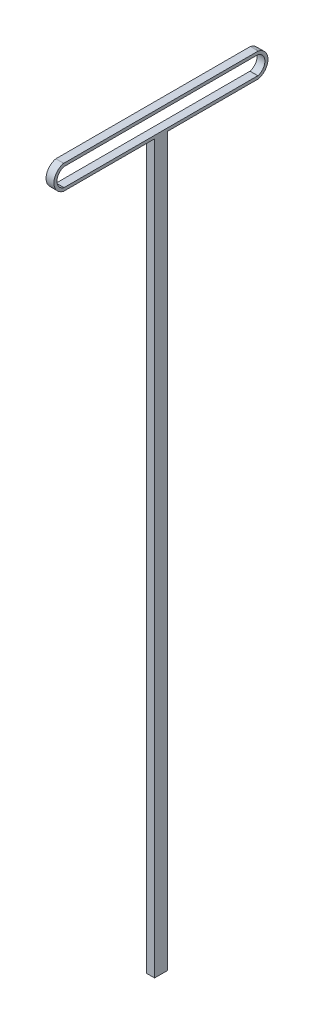
ISO-10303-21;
HEADER;
FILE_DESCRIPTION(('STEP AP214'),'2;1');
FILE_NAME('part.step','',(''),(''),'','','');
FILE_SCHEMA(('AUTOMOTIVE_DESIGN { 1 0 10303 214 1 1 1 1 }'));
ENDSEC;
DATA;
#1=APPLICATION_CONTEXT('core data for automotive mechanical design processes');
#2=APPLICATION_PROTOCOL_DEFINITION('international standard','automotive_design',2000,#1);
#3=PRODUCT_CONTEXT('',#1,'mechanical');
#4=PRODUCT('Part','Part','',(#3));
#5=PRODUCT_RELATED_PRODUCT_CATEGORY('part','',(#4));
#6=PRODUCT_DEFINITION_FORMATION('','',#4);
#7=PRODUCT_DEFINITION_CONTEXT('part definition',#1,'design');
#8=PRODUCT_DEFINITION('design','',#6,#7);
#9=PRODUCT_DEFINITION_SHAPE('','',#8);
#10=(LENGTH_UNIT() NAMED_UNIT(*) SI_UNIT(.MILLI.,.METRE.));
#11=(NAMED_UNIT(*) PLANE_ANGLE_UNIT() SI_UNIT($,.RADIAN.));
#12=(NAMED_UNIT(*) SI_UNIT($,.STERADIAN.) SOLID_ANGLE_UNIT());
#13=UNCERTAINTY_MEASURE_WITH_UNIT(LENGTH_MEASURE(1.E-05),#10,'distance_accuracy_value','');
#14=(GEOMETRIC_REPRESENTATION_CONTEXT(3) GLOBAL_UNCERTAINTY_ASSIGNED_CONTEXT((#13)) GLOBAL_UNIT_ASSIGNED_CONTEXT((#10,
#11,#12)) REPRESENTATION_CONTEXT('',''));
#15=CARTESIAN_POINT('',(0.,0.,0.));
#16=DIRECTION('',(0.,0.,1.));
#17=DIRECTION('',(1.,0.,0.));
#18=AXIS2_PLACEMENT_3D('',#15,#16,#17);
#19=CARTESIAN_POINT('',(6.5,-20.,160.579938888516));
#20=DIRECTION('',(0.,1.,0.));
#21=DIRECTION('',(0.,0.,1.));
#22=AXIS2_PLACEMENT_3D('',#19,#20,#21);
#23=PLANE('',#22);
#24=DIRECTION('',(1.,0.,0.));
#25=VECTOR('',#24,1.);
#26=CARTESIAN_POINT('',(-6.5,-20.,-10.4938581085758));
#27=LINE('',#26,#25);
#28=CARTESIAN_POINT('',(-6.5,-20.,-10.4938581085757));
#29=VERTEX_POINT('',#28);
#30=CARTESIAN_POINT('',(6.5,-20.,-10.4938581085757));
#31=VERTEX_POINT('',#30);
#32=EDGE_CURVE('E142',#29,#31,#27,.T.);
#33=ORIENTED_EDGE('',*,*,#32,.F.);
#34=DIRECTION('',(0.,0.,-1.));
#35=VECTOR('',#34,1.);
#36=CARTESIAN_POINT('',(-6.5,-20.,160.579938888516));
#37=LINE('',#36,#35);
#38=CARTESIAN_POINT('',(-6.5,-20.,-160.579938888516));
#39=VERTEX_POINT('',#38);
#40=EDGE_CURVE('E196',#29,#39,#37,.T.);
#41=ORIENTED_EDGE('',*,*,#40,.T.);
#42=DIRECTION('',(-1.,0.,0.));
#43=VECTOR('',#42,1.);
#44=CARTESIAN_POINT('',(6.5,-20.,-160.579938888516));
#45=LINE('',#44,#43);
#46=CARTESIAN_POINT('',(6.5,-20.,-160.579938888516));
#47=VERTEX_POINT('',#46);
#48=EDGE_CURVE('E42',#47,#39,#45,.T.);
#49=ORIENTED_EDGE('',*,*,#48,.F.);
#50=DIRECTION('',(0.,0.,-1.));
#51=VECTOR('',#50,1.);
#52=CARTESIAN_POINT('',(6.5,-20.,160.579938888516));
#53=LINE('',#52,#51);
#54=EDGE_CURVE('E49',#31,#47,#53,.T.);
#55=ORIENTED_EDGE('',*,*,#54,.F.);
#56=EDGE_LOOP('',(#33,#41,#49,#55));
#57=FACE_BOUND('',#56,.T.);
#58=ADVANCED_FACE('F34',(#57),#23,.F.);
#59=DIRECTION('',(-1.,0.,0.));
#60=VECTOR('',#59,1.);
#61=CARTESIAN_POINT('',(-6.5,-20.,10.4938581085758));
#62=LINE('',#61,#60);
#63=CARTESIAN_POINT('',(6.5,-20.,10.4938581085758));
#64=VERTEX_POINT('',#63);
#65=CARTESIAN_POINT('',(-6.5,-20.,10.4938581085758));
#66=VERTEX_POINT('',#65);
#67=EDGE_CURVE('E57',#64,#66,#62,.T.);
#68=ORIENTED_EDGE('',*,*,#67,.F.);
#69=CARTESIAN_POINT('',(6.5,-20.,160.579938888516));
#70=VERTEX_POINT('',#69);
#71=EDGE_CURVE('E147',#70,#64,#53,.T.);
#72=ORIENTED_EDGE('',*,*,#71,.F.);
#73=DIRECTION('',(-1.,0.,0.));
#74=VECTOR('',#73,1.);
#75=CARTESIAN_POINT('',(6.5,-20.,160.579938888516));
#76=LINE('',#75,#74);
#77=CARTESIAN_POINT('',(-6.5,-20.,160.579938888516));
#78=VERTEX_POINT('',#77);
#79=EDGE_CURVE('E11',#70,#78,#76,.T.);
#80=ORIENTED_EDGE('',*,*,#79,.T.);
#81=EDGE_CURVE('E197',#78,#66,#37,.T.);
#82=ORIENTED_EDGE('',*,*,#81,.T.);
#83=EDGE_LOOP('',(#68,#72,#80,#82));
#84=FACE_BOUND('',#83,.T.);
#85=ADVANCED_FACE('F245',(#84),#23,.F.);
#86=CARTESIAN_POINT('',(6.5,0.,156.195855798208));
#87=DIRECTION('',(1.,0.,0.));
#88=DIRECTION('',(0.,0.,-1.));
#89=AXIS2_PLACEMENT_3D('',#86,#87,#88);
#90=PLANE('',#89);
#91=CARTESIAN_POINT('',(6.5,0.,156.195855798208));
#92=DIRECTION('',(1.,0.,0.));
#93=DIRECTION('',(0.,0.,-1.));
#94=AXIS2_PLACEMENT_3D('',#91,#92,#93);
#95=CIRCLE('',#94,20.4748671434693);
#96=CARTESIAN_POINT('',(6.5,20.,160.579938888516));
#97=VERTEX_POINT('',#96);
#98=EDGE_CURVE('E185',#97,#70,#95,.T.);
#99=ORIENTED_EDGE('',*,*,#98,.T.);
#100=ORIENTED_EDGE('',*,*,#71,.T.);
#101=DIRECTION('',(0.,1.,0.));
#102=VECTOR('',#101,1.);
#103=CARTESIAN_POINT('',(6.5,-1220.,10.4938581085758));
#104=LINE('',#103,#102);
#105=CARTESIAN_POINT('',(6.5,-1220.,10.4938581085758));
#106=VERTEX_POINT('',#105);
#107=EDGE_CURVE('E127',#106,#64,#104,.T.);
#108=ORIENTED_EDGE('',*,*,#107,.F.);
#109=DIRECTION('',(0.,0.,1.));
#110=VECTOR('',#109,1.);
#111=CARTESIAN_POINT('',(6.5,-1220.,10.4938581085758));
#112=LINE('',#111,#110);
#113=CARTESIAN_POINT('',(6.5,-1220.,-10.4938581085758));
#114=VERTEX_POINT('',#113);
#115=EDGE_CURVE('E133',#114,#106,#112,.T.);
#116=ORIENTED_EDGE('',*,*,#115,.F.);
#117=DIRECTION('',(0.,1.,0.));
#118=VECTOR('',#117,1.);
#119=CARTESIAN_POINT('',(6.5,-1220.,-10.4938581085758));
#120=LINE('',#119,#118);
#121=EDGE_CURVE('E227',#114,#31,#120,.T.);
#122=ORIENTED_EDGE('',*,*,#121,.T.);
#123=ORIENTED_EDGE('',*,*,#54,.T.);
#124=CARTESIAN_POINT('',(6.5,0.,-156.195855798208));
#125=DIRECTION('',(1.,0.,0.));
#126=DIRECTION('',(0.,0.,1.));
#127=AXIS2_PLACEMENT_3D('',#124,#125,#126);
#128=CIRCLE('',#127,20.4748671434693);
#129=CARTESIAN_POINT('',(6.5,20.,-160.579938888516));
#130=VERTEX_POINT('',#129);
#131=EDGE_CURVE('E189',#47,#130,#128,.T.);
#132=ORIENTED_EDGE('',*,*,#131,.T.);
#133=DIRECTION('',(0.,0.,1.));
#134=VECTOR('',#133,1.);
#135=CARTESIAN_POINT('',(6.5,20.,160.579938888516));
#136=LINE('',#135,#134);
#137=EDGE_CURVE('E191',#130,#97,#136,.T.);
#138=ORIENTED_EDGE('',*,*,#137,.T.);
#139=EDGE_LOOP('',(#99,#100,#108,#116,#122,#123,#132,#138));
#140=FACE_BOUND('',#139,.T.);
#141=DIRECTION('',(0.,0.,1.));
#142=VECTOR('',#141,1.);
#143=CARTESIAN_POINT('',(6.5,15.,160.));
#144=LINE('',#143,#142);
#145=CARTESIAN_POINT('',(6.5,15.,-160.));
#146=VERTEX_POINT('',#145);
#147=CARTESIAN_POINT('',(6.5,15.,160.));
#148=VERTEX_POINT('',#147);
#149=EDGE_CURVE('E159',#146,#148,#144,.T.);
#150=ORIENTED_EDGE('',*,*,#149,.F.);
#151=CARTESIAN_POINT('',(6.5,0.,-156.195855798208));
#152=DIRECTION('',(1.,0.,0.));
#153=DIRECTION('',(0.,0.,1.));
#154=AXIS2_PLACEMENT_3D('',#151,#152,#153);
#155=CIRCLE('',#154,15.4748671434693);
#156=CARTESIAN_POINT('',(6.5,-15.,-160.));
#157=VERTEX_POINT('',#156);
#158=EDGE_CURVE('E157',#157,#146,#155,.T.);
#159=ORIENTED_EDGE('',*,*,#158,.F.);
#160=DIRECTION('',(0.,0.,-1.));
#161=VECTOR('',#160,1.);
#162=CARTESIAN_POINT('',(6.5,-15.,160.));
#163=LINE('',#162,#161);
#164=CARTESIAN_POINT('',(6.5,-15.,160.));
#165=VERTEX_POINT('',#164);
#166=EDGE_CURVE('E165',#165,#157,#163,.T.);
#167=ORIENTED_EDGE('',*,*,#166,.F.);
#168=CARTESIAN_POINT('',(6.5,0.,156.195855798208));
#169=DIRECTION('',(1.,0.,0.));
#170=DIRECTION('',(0.,0.,-1.));
#171=AXIS2_PLACEMENT_3D('',#168,#169,#170);
#172=CIRCLE('',#171,15.4748671434693);
#173=EDGE_CURVE('E162',#148,#165,#172,.T.);
#174=ORIENTED_EDGE('',*,*,#173,.F.);
#175=EDGE_LOOP('',(#150,#159,#167,#174));
#176=FACE_BOUND('',#175,.T.);
#177=ADVANCED_FACE('F145',(#140,#176),#90,.T.);
#178=CARTESIAN_POINT('',(-6.5,0.,156.195855798208));
#179=DIRECTION('',(1.,0.,0.));
#180=DIRECTION('',(0.,0.,-1.));
#181=AXIS2_PLACEMENT_3D('',#178,#179,#180);
#182=PLANE('',#181);
#183=CARTESIAN_POINT('',(-6.5,0.,156.195855798208));
#184=DIRECTION('',(1.,0.,0.));
#185=DIRECTION('',(0.,0.,-1.));
#186=AXIS2_PLACEMENT_3D('',#183,#184,#185);
#187=CIRCLE('',#186,20.4748671434693);
#188=CARTESIAN_POINT('',(-6.5,20.,160.579938888516));
#189=VERTEX_POINT('',#188);
#190=EDGE_CURVE('E184',#189,#78,#187,.T.);
#191=ORIENTED_EDGE('',*,*,#190,.F.);
#192=DIRECTION('',(0.,0.,1.));
#193=VECTOR('',#192,1.);
#194=CARTESIAN_POINT('',(-6.5,20.,160.579938888516));
#195=LINE('',#194,#193);
#196=CARTESIAN_POINT('',(-6.5,20.,-160.579938888516));
#197=VERTEX_POINT('',#196);
#198=EDGE_CURVE('E187',#197,#189,#195,.T.);
#199=ORIENTED_EDGE('',*,*,#198,.F.);
#200=CARTESIAN_POINT('',(-6.5,0.,-156.195855798208));
#201=DIRECTION('',(1.,0.,0.));
#202=DIRECTION('',(0.,0.,1.));
#203=AXIS2_PLACEMENT_3D('',#200,#201,#202);
#204=CIRCLE('',#203,20.4748671434693);
#205=EDGE_CURVE('E199',#39,#197,#204,.T.);
#206=ORIENTED_EDGE('',*,*,#205,.F.);
#207=ORIENTED_EDGE('',*,*,#40,.F.);
#208=DIRECTION('',(0.,1.,0.));
#209=VECTOR('',#208,1.);
#210=CARTESIAN_POINT('',(-6.5,-1220.,-10.4938581085758));
#211=LINE('',#210,#209);
#212=CARTESIAN_POINT('',(-6.5,-1220.,-10.4938581085758));
#213=VERTEX_POINT('',#212);
#214=EDGE_CURVE('E153',#213,#29,#211,.T.);
#215=ORIENTED_EDGE('',*,*,#214,.F.);
#216=DIRECTION('',(0.,0.,-1.));
#217=VECTOR('',#216,1.);
#218=CARTESIAN_POINT('',(-6.5,-1220.,10.4938581085758));
#219=LINE('',#218,#217);
#220=CARTESIAN_POINT('',(-6.5,-1220.,10.4938581085758));
#221=VERTEX_POINT('',#220);
#222=EDGE_CURVE('E132',#221,#213,#219,.T.);
#223=ORIENTED_EDGE('',*,*,#222,.F.);
#224=DIRECTION('',(0.,1.,0.));
#225=VECTOR('',#224,1.);
#226=CARTESIAN_POINT('',(-6.5,-1220.,10.4938581085758));
#227=LINE('',#226,#225);
#228=EDGE_CURVE('E129',#221,#66,#227,.T.);
#229=ORIENTED_EDGE('',*,*,#228,.T.);
#230=ORIENTED_EDGE('',*,*,#81,.F.);
#231=EDGE_LOOP('',(#191,#199,#206,#207,#215,#223,#229,#230));
#232=FACE_BOUND('',#231,.T.);
#233=CARTESIAN_POINT('',(-6.5,0.,-156.195855798208));
#234=DIRECTION('',(1.,0.,0.));
#235=DIRECTION('',(0.,0.,1.));
#236=AXIS2_PLACEMENT_3D('',#233,#234,#235);
#237=CIRCLE('',#236,15.4748671434693);
#238=CARTESIAN_POINT('',(-6.5,-15.,-160.));
#239=VERTEX_POINT('',#238);
#240=CARTESIAN_POINT('',(-6.5,15.,-160.));
#241=VERTEX_POINT('',#240);
#242=EDGE_CURVE('E148',#239,#241,#237,.T.);
#243=ORIENTED_EDGE('',*,*,#242,.T.);
#244=DIRECTION('',(0.,0.,1.));
#245=VECTOR('',#244,1.);
#246=CARTESIAN_POINT('',(-6.5,15.,160.));
#247=LINE('',#246,#245);
#248=CARTESIAN_POINT('',(-6.5,15.,160.));
#249=VERTEX_POINT('',#248);
#250=EDGE_CURVE('E151',#241,#249,#247,.T.);
#251=ORIENTED_EDGE('',*,*,#250,.T.);
#252=CARTESIAN_POINT('',(-6.5,0.,156.195855798208));
#253=DIRECTION('',(1.,0.,0.));
#254=DIRECTION('',(0.,0.,-1.));
#255=AXIS2_PLACEMENT_3D('',#252,#253,#254);
#256=CIRCLE('',#255,15.4748671434693);
#257=CARTESIAN_POINT('',(-6.5,-15.,160.));
#258=VERTEX_POINT('',#257);
#259=EDGE_CURVE('E170',#249,#258,#256,.T.);
#260=ORIENTED_EDGE('',*,*,#259,.T.);
#261=DIRECTION('',(0.,0.,-1.));
#262=VECTOR('',#261,1.);
#263=CARTESIAN_POINT('',(-6.5,-15.,160.));
#264=LINE('',#263,#262);
#265=EDGE_CURVE('E160',#258,#239,#264,.T.);
#266=ORIENTED_EDGE('',*,*,#265,.T.);
#267=EDGE_LOOP('',(#243,#251,#260,#266));
#268=FACE_BOUND('',#267,.T.);
#269=ADVANCED_FACE('F216',(#232,#268),#182,.F.);
#270=CARTESIAN_POINT('',(6.5,0.,156.195855798208));
#271=DIRECTION('',(-1.,0.,0.));
#272=DIRECTION('',(0.,0.,1.));
#273=AXIS2_PLACEMENT_3D('',#270,#271,#272);
#274=CYLINDRICAL_SURFACE('',#273,20.4748671434693);
#275=ORIENTED_EDGE('',*,*,#190,.T.);
#276=ORIENTED_EDGE('',*,*,#79,.F.);
#277=ORIENTED_EDGE('',*,*,#98,.F.);
#278=DIRECTION('',(-1.,0.,0.));
#279=VECTOR('',#278,1.);
#280=CARTESIAN_POINT('',(6.5,20.,160.579938888516));
#281=LINE('',#280,#279);
#282=EDGE_CURVE('E193',#97,#189,#281,.T.);
#283=ORIENTED_EDGE('',*,*,#282,.T.);
#284=EDGE_LOOP('',(#275,#276,#277,#283));
#285=FACE_BOUND('',#284,.T.);
#286=ADVANCED_FACE('F36',(#285),#274,.T.);
#287=CARTESIAN_POINT('',(6.5,0.,-156.195855798208));
#288=DIRECTION('',(-1.,0.,0.));
#289=DIRECTION('',(0.,0.,1.));
#290=AXIS2_PLACEMENT_3D('',#287,#288,#289);
#291=CYLINDRICAL_SURFACE('',#290,20.4748671434693);
#292=ORIENTED_EDGE('',*,*,#205,.T.);
#293=DIRECTION('',(-1.,0.,0.));
#294=VECTOR('',#293,1.);
#295=CARTESIAN_POINT('',(6.5,20.,-160.579938888516));
#296=LINE('',#295,#294);
#297=EDGE_CURVE('E204',#130,#197,#296,.T.);
#298=ORIENTED_EDGE('',*,*,#297,.F.);
#299=ORIENTED_EDGE('',*,*,#131,.F.);
#300=ORIENTED_EDGE('',*,*,#48,.T.);
#301=EDGE_LOOP('',(#292,#298,#299,#300));
#302=FACE_BOUND('',#301,.T.);
#303=ADVANCED_FACE('F210',(#302),#291,.T.);
#304=CARTESIAN_POINT('',(6.5,20.,160.579938888516));
#305=DIRECTION('',(0.,-1.,0.));
#306=DIRECTION('',(0.,0.,-1.));
#307=AXIS2_PLACEMENT_3D('',#304,#305,#306);
#308=PLANE('',#307);
#309=ORIENTED_EDGE('',*,*,#198,.T.);
#310=ORIENTED_EDGE('',*,*,#282,.F.);
#311=ORIENTED_EDGE('',*,*,#137,.F.);
#312=ORIENTED_EDGE('',*,*,#297,.T.);
#313=EDGE_LOOP('',(#309,#310,#311,#312));
#314=FACE_BOUND('',#313,.T.);
#315=ADVANCED_FACE('F222',(#314),#308,.F.);
#316=CARTESIAN_POINT('',(6.5,0.,-156.195855798208));
#317=DIRECTION('',(-1.,0.,0.));
#318=DIRECTION('',(0.,0.,1.));
#319=AXIS2_PLACEMENT_3D('',#316,#317,#318);
#320=CYLINDRICAL_SURFACE('',#319,15.4748671434693);
#321=ORIENTED_EDGE('',*,*,#242,.F.);
#322=DIRECTION('',(-1.,0.,0.));
#323=VECTOR('',#322,1.);
#324=CARTESIAN_POINT('',(6.5,-15.,-160.));
#325=LINE('',#324,#323);
#326=EDGE_CURVE('E166',#157,#239,#325,.T.);
#327=ORIENTED_EDGE('',*,*,#326,.F.);
#328=ORIENTED_EDGE('',*,*,#158,.T.);
#329=DIRECTION('',(-1.,0.,0.));
#330=VECTOR('',#329,1.);
#331=CARTESIAN_POINT('',(6.5,15.,-160.));
#332=LINE('',#331,#330);
#333=EDGE_CURVE('E181',#146,#241,#332,.T.);
#334=ORIENTED_EDGE('',*,*,#333,.T.);
#335=EDGE_LOOP('',(#321,#327,#328,#334));
#336=FACE_BOUND('',#335,.T.);
#337=ADVANCED_FACE('F254',(#336),#320,.F.);
#338=CARTESIAN_POINT('',(6.5,15.,160.));
#339=DIRECTION('',(0.,-1.,0.));
#340=DIRECTION('',(0.,0.,-1.));
#341=AXIS2_PLACEMENT_3D('',#338,#339,#340);
#342=PLANE('',#341);
#343=ORIENTED_EDGE('',*,*,#250,.F.);
#344=ORIENTED_EDGE('',*,*,#333,.F.);
#345=ORIENTED_EDGE('',*,*,#149,.T.);
#346=DIRECTION('',(-1.,0.,0.));
#347=VECTOR('',#346,1.);
#348=CARTESIAN_POINT('',(6.5,15.,160.));
#349=LINE('',#348,#347);
#350=EDGE_CURVE('E179',#148,#249,#349,.T.);
#351=ORIENTED_EDGE('',*,*,#350,.T.);
#352=EDGE_LOOP('',(#343,#344,#345,#351));
#353=FACE_BOUND('',#352,.T.);
#354=ADVANCED_FACE('F261',(#353),#342,.T.);
#355=CARTESIAN_POINT('',(6.5,0.,156.195855798208));
#356=DIRECTION('',(-1.,0.,0.));
#357=DIRECTION('',(0.,0.,1.));
#358=AXIS2_PLACEMENT_3D('',#355,#356,#357);
#359=CYLINDRICAL_SURFACE('',#358,15.4748671434693);
#360=ORIENTED_EDGE('',*,*,#259,.F.);
#361=ORIENTED_EDGE('',*,*,#350,.F.);
#362=ORIENTED_EDGE('',*,*,#173,.T.);
#363=DIRECTION('',(-1.,0.,0.));
#364=VECTOR('',#363,1.);
#365=CARTESIAN_POINT('',(6.5,-15.,160.));
#366=LINE('',#365,#364);
#367=EDGE_CURVE('E177',#165,#258,#366,.T.);
#368=ORIENTED_EDGE('',*,*,#367,.T.);
#369=EDGE_LOOP('',(#360,#361,#362,#368));
#370=FACE_BOUND('',#369,.T.);
#371=ADVANCED_FACE('F265',(#370),#359,.F.);
#372=CARTESIAN_POINT('',(6.5,-15.,160.));
#373=DIRECTION('',(0.,1.,0.));
#374=DIRECTION('',(0.,0.,1.));
#375=AXIS2_PLACEMENT_3D('',#372,#373,#374);
#376=PLANE('',#375);
#377=ORIENTED_EDGE('',*,*,#265,.F.);
#378=ORIENTED_EDGE('',*,*,#367,.F.);
#379=ORIENTED_EDGE('',*,*,#166,.T.);
#380=ORIENTED_EDGE('',*,*,#326,.T.);
#381=EDGE_LOOP('',(#377,#378,#379,#380));
#382=FACE_BOUND('',#381,.T.);
#383=ADVANCED_FACE('F242',(#382),#376,.T.);
#384=CARTESIAN_POINT('',(-6.5,-1220.,10.4938581085758));
#385=DIRECTION('',(0.,0.,-1.));
#386=DIRECTION('',(-1.,0.,0.));
#387=AXIS2_PLACEMENT_3D('',#384,#385,#386);
#388=PLANE('',#387);
#389=ORIENTED_EDGE('',*,*,#67,.T.);
#390=ORIENTED_EDGE('',*,*,#228,.F.);
#391=DIRECTION('',(-1.,0.,0.));
#392=VECTOR('',#391,1.);
#393=CARTESIAN_POINT('',(-6.5,-1220.,10.4938581085758));
#394=LINE('',#393,#392);
#395=EDGE_CURVE('E123',#106,#221,#394,.T.);
#396=ORIENTED_EDGE('',*,*,#395,.F.);
#397=ORIENTED_EDGE('',*,*,#107,.T.);
#398=EDGE_LOOP('',(#389,#390,#396,#397));
#399=FACE_BOUND('',#398,.T.);
#400=ADVANCED_FACE('F125',(#399),#388,.F.);
#401=CARTESIAN_POINT('',(-6.5,-1220.,-10.4938581085758));
#402=DIRECTION('',(0.,0.,1.));
#403=DIRECTION('',(1.,0.,0.));
#404=AXIS2_PLACEMENT_3D('',#401,#402,#403);
#405=PLANE('',#404);
#406=ORIENTED_EDGE('',*,*,#32,.T.);
#407=ORIENTED_EDGE('',*,*,#121,.F.);
#408=DIRECTION('',(1.,0.,0.));
#409=VECTOR('',#408,1.);
#410=CARTESIAN_POINT('',(-6.5,-1220.,-10.4938581085758));
#411=LINE('',#410,#409);
#412=EDGE_CURVE('E138',#213,#114,#411,.T.);
#413=ORIENTED_EDGE('',*,*,#412,.F.);
#414=ORIENTED_EDGE('',*,*,#214,.T.);
#415=EDGE_LOOP('',(#406,#407,#413,#414));
#416=FACE_BOUND('',#415,.T.);
#417=ADVANCED_FACE('F234',(#416),#405,.F.);
#418=CARTESIAN_POINT('',(0.,-1220.,0.));
#419=DIRECTION('',(0.,-1.,0.));
#420=DIRECTION('',(0.,0.,-1.));
#421=AXIS2_PLACEMENT_3D('',#418,#419,#420);
#422=PLANE('',#421);
#423=ORIENTED_EDGE('',*,*,#115,.T.);
#424=ORIENTED_EDGE('',*,*,#395,.T.);
#425=ORIENTED_EDGE('',*,*,#222,.T.);
#426=ORIENTED_EDGE('',*,*,#412,.T.);
#427=EDGE_LOOP('',(#423,#424,#425,#426));
#428=FACE_BOUND('',#427,.T.);
#429=ADVANCED_FACE('F136',(#428),#422,.T.);
#430=CLOSED_SHELL('',(#58,#85,#177,#269,#286,#303,#315,#337,#354,#371,#383,#400,#417,#429));
#431=MANIFOLD_SOLID_BREP('B2',#430);
#432=ADVANCED_BREP_SHAPE_REPRESENTATION('',(#18,#431),#14);
#433=SHAPE_DEFINITION_REPRESENTATION(#9,#432);
ENDSEC;
END-ISO-10303-21;
